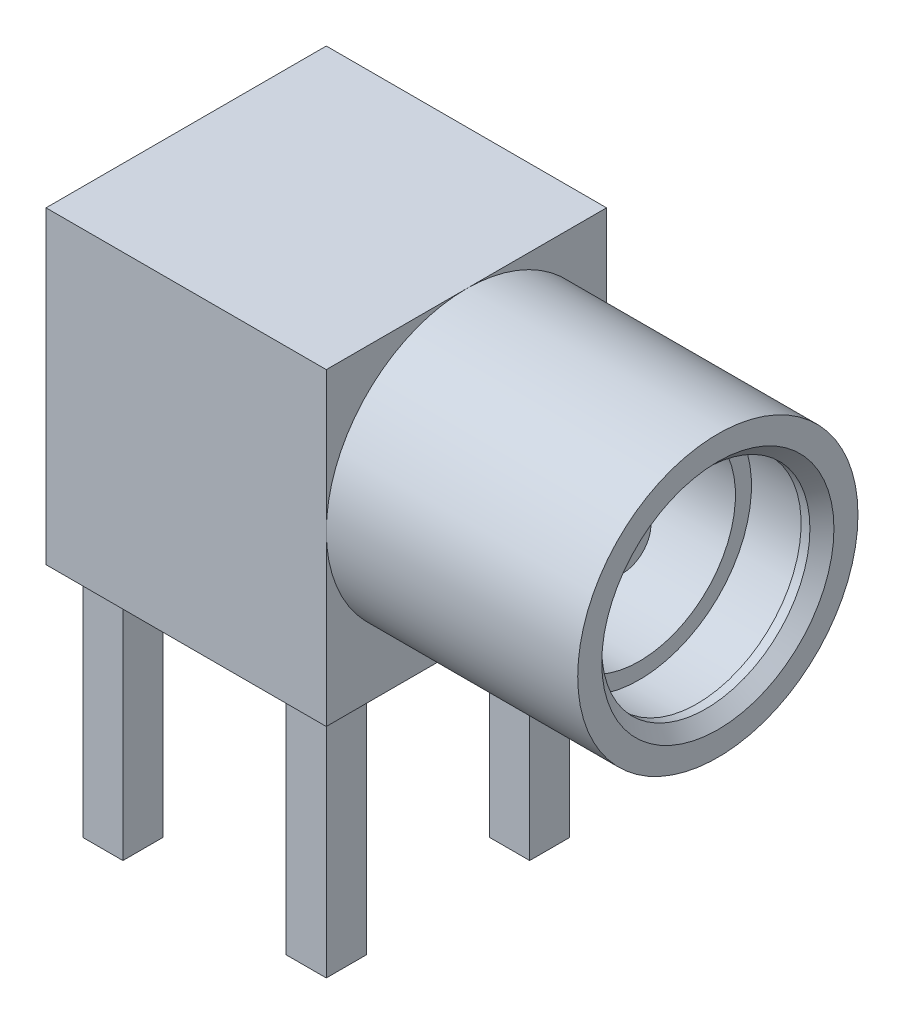
ISO-10303-21;
HEADER;
FILE_DESCRIPTION(('STEP AP214'),'2;1');
FILE_NAME('part.step','',(''),(''),'','','');
FILE_SCHEMA(('AUTOMOTIVE_DESIGN { 1 0 10303 214 1 1 1 1 }'));
ENDSEC;
DATA;
#1=APPLICATION_CONTEXT('core data for automotive mechanical design processes');
#2=APPLICATION_PROTOCOL_DEFINITION('international standard','automotive_design',2000,#1);
#3=PRODUCT_CONTEXT('',#1,'mechanical');
#4=PRODUCT('Part','Part','',(#3));
#5=PRODUCT_RELATED_PRODUCT_CATEGORY('part','',(#4));
#6=PRODUCT_DEFINITION_FORMATION('','',#4);
#7=PRODUCT_DEFINITION_CONTEXT('part definition',#1,'design');
#8=PRODUCT_DEFINITION('design','',#6,#7);
#9=PRODUCT_DEFINITION_SHAPE('','',#8);
#10=(LENGTH_UNIT() NAMED_UNIT(*) SI_UNIT(.MILLI.,.METRE.));
#11=(NAMED_UNIT(*) PLANE_ANGLE_UNIT() SI_UNIT($,.RADIAN.));
#12=(NAMED_UNIT(*) SI_UNIT($,.STERADIAN.) SOLID_ANGLE_UNIT());
#13=UNCERTAINTY_MEASURE_WITH_UNIT(LENGTH_MEASURE(1.E-05),#10,'distance_accuracy_value','');
#14=(GEOMETRIC_REPRESENTATION_CONTEXT(3) GLOBAL_UNCERTAINTY_ASSIGNED_CONTEXT((#13)) GLOBAL_UNIT_ASSIGNED_CONTEXT((#10,
#11,#12)) REPRESENTATION_CONTEXT('',''));
#15=CARTESIAN_POINT('',(0.,0.,0.));
#16=DIRECTION('',(0.,0.,1.));
#17=DIRECTION('',(1.,0.,0.));
#18=AXIS2_PLACEMENT_3D('',#15,#16,#17);
#19=CARTESIAN_POINT('',(41.5125000000001,-45.7600000000006,24.29));
#20=DIRECTION('',(0.,-1.,0.));
#21=DIRECTION('',(0.,0.,-1.));
#22=AXIS2_PLACEMENT_3D('',#19,#20,#21);
#23=PLANE('',#22);
#24=CARTESIAN_POINT('',(39.7625000000001,-45.7600000000006,22.54));
#25=DIRECTION('',(0.,-1.,0.));
#26=DIRECTION('',(0.,0.,-1.));
#27=AXIS2_PLACEMENT_3D('',#24,#25,#26);
#28=CIRCLE('',#27,0.354999999999999);
#29=CARTESIAN_POINT('',(39.7625000000001,-45.7600000000006,22.185));
#30=VERTEX_POINT('',#29);
#31=EDGE_CURVE('E409',#30,#30,#28,.T.);
#32=ORIENTED_EDGE('',*,*,#31,.F.);
#33=EDGE_LOOP('',(#32));
#34=FACE_BOUND('',#33,.T.);
#35=DIRECTION('',(-1.,0.,0.));
#36=VECTOR('',#35,1.);
#37=CARTESIAN_POINT('',(41.5125000000001,-45.7600000000006,20.79));
#38=LINE('',#37,#36);
#39=CARTESIAN_POINT('',(41.5125000000001,-45.7600000000006,20.79));
#40=VERTEX_POINT('',#39);
#41=CARTESIAN_POINT('',(38.0125000000001,-45.7600000000006,20.79));
#42=VERTEX_POINT('',#41);
#43=EDGE_CURVE('E307',#40,#42,#38,.T.);
#44=ORIENTED_EDGE('',*,*,#43,.F.);
#45=DIRECTION('',(0.,0.,-1.));
#46=VECTOR('',#45,1.);
#47=CARTESIAN_POINT('',(41.5125000000001,-45.7600000000006,24.29));
#48=LINE('',#47,#46);
#49=CARTESIAN_POINT('',(41.5125000000001,-45.7600000000006,24.29));
#50=VERTEX_POINT('',#49);
#51=EDGE_CURVE('E330',#50,#40,#48,.T.);
#52=ORIENTED_EDGE('',*,*,#51,.F.);
#53=DIRECTION('',(-1.,0.,0.));
#54=VECTOR('',#53,1.);
#55=CARTESIAN_POINT('',(41.5125000000001,-45.7600000000006,24.29));
#56=LINE('',#55,#54);
#57=CARTESIAN_POINT('',(38.0125000000001,-45.7600000000006,24.29));
#58=VERTEX_POINT('',#57);
#59=EDGE_CURVE('E314',#50,#58,#56,.T.);
#60=ORIENTED_EDGE('',*,*,#59,.T.);
#61=DIRECTION('',(0.,0.,-1.));
#62=VECTOR('',#61,1.);
#63=CARTESIAN_POINT('',(38.0125000000001,-45.7600000000006,24.29));
#64=LINE('',#63,#62);
#65=EDGE_CURVE('E328',#58,#42,#64,.T.);
#66=ORIENTED_EDGE('',*,*,#65,.T.);
#67=EDGE_LOOP('',(#44,#52,#60,#66));
#68=FACE_BOUND('',#67,.T.);
#69=DIRECTION('',(1.,0.,0.));
#70=VECTOR('',#69,1.);
#71=CARTESIAN_POINT('',(38.2425000000001,-45.7600000000006,23.56));
#72=LINE('',#71,#70);
#73=CARTESIAN_POINT('',(38.2425000000001,-45.7600000000006,23.56));
#74=VERTEX_POINT('',#73);
#75=CARTESIAN_POINT('',(38.7425000000001,-45.7600000000006,23.56));
#76=VERTEX_POINT('',#75);
#77=EDGE_CURVE('E279',#74,#76,#72,.T.);
#78=ORIENTED_EDGE('',*,*,#77,.F.);
#79=DIRECTION('',(0.,0.,-1.));
#80=VECTOR('',#79,1.);
#81=CARTESIAN_POINT('',(38.2425000000001,-45.7600000000006,24.06));
#82=LINE('',#81,#80);
#83=CARTESIAN_POINT('',(38.2425000000001,-45.7600000000006,24.06));
#84=VERTEX_POINT('',#83);
#85=EDGE_CURVE('E265',#84,#74,#82,.T.);
#86=ORIENTED_EDGE('',*,*,#85,.F.);
#87=DIRECTION('',(-1.,0.,0.));
#88=VECTOR('',#87,1.);
#89=CARTESIAN_POINT('',(38.2425000000001,-45.7600000000006,24.06));
#90=LINE('',#89,#88);
#91=CARTESIAN_POINT('',(38.7425000000001,-45.7600000000006,24.06));
#92=VERTEX_POINT('',#91);
#93=EDGE_CURVE('E270',#92,#84,#90,.T.);
#94=ORIENTED_EDGE('',*,*,#93,.F.);
#95=DIRECTION('',(0.,0.,1.));
#96=VECTOR('',#95,1.);
#97=CARTESIAN_POINT('',(38.7425000000001,-45.7600000000006,24.06));
#98=LINE('',#97,#96);
#99=EDGE_CURVE('E281',#76,#92,#98,.T.);
#100=ORIENTED_EDGE('',*,*,#99,.F.);
#101=EDGE_LOOP('',(#78,#86,#94,#100));
#102=FACE_BOUND('',#101,.T.);
#103=DIRECTION('',(0.,0.,-1.));
#104=VECTOR('',#103,1.);
#105=CARTESIAN_POINT('',(40.7825000000001,-45.7600000000006,24.06));
#106=LINE('',#105,#104);
#107=CARTESIAN_POINT('',(40.7825000000001,-45.7600000000006,24.06));
#108=VERTEX_POINT('',#107);
#109=CARTESIAN_POINT('',(40.7825000000001,-45.7600000000006,23.56));
#110=VERTEX_POINT('',#109);
#111=EDGE_CURVE('E250',#108,#110,#106,.T.);
#112=ORIENTED_EDGE('',*,*,#111,.F.);
#113=DIRECTION('',(-1.,0.,0.));
#114=VECTOR('',#113,1.);
#115=CARTESIAN_POINT('',(41.2825000000001,-45.7600000000006,24.06));
#116=LINE('',#115,#114);
#117=CARTESIAN_POINT('',(41.2825000000001,-45.7600000000006,24.06));
#118=VERTEX_POINT('',#117);
#119=EDGE_CURVE('E236',#118,#108,#116,.T.);
#120=ORIENTED_EDGE('',*,*,#119,.F.);
#121=DIRECTION('',(0.,0.,1.));
#122=VECTOR('',#121,1.);
#123=CARTESIAN_POINT('',(41.2825000000001,-45.7600000000006,24.06));
#124=LINE('',#123,#122);
#125=CARTESIAN_POINT('',(41.2825000000001,-45.7600000000006,23.56));
#126=VERTEX_POINT('',#125);
#127=EDGE_CURVE('E241',#126,#118,#124,.T.);
#128=ORIENTED_EDGE('',*,*,#127,.F.);
#129=DIRECTION('',(1.,0.,0.));
#130=VECTOR('',#129,1.);
#131=CARTESIAN_POINT('',(41.2825000000001,-45.7600000000006,23.56));
#132=LINE('',#131,#130);
#133=EDGE_CURVE('E252',#110,#126,#132,.T.);
#134=ORIENTED_EDGE('',*,*,#133,.F.);
#135=EDGE_LOOP('',(#112,#120,#128,#134));
#136=FACE_BOUND('',#135,.T.);
#137=DIRECTION('',(-1.,0.,0.));
#138=VECTOR('',#137,1.);
#139=CARTESIAN_POINT('',(41.2825000000001,-45.7600000000006,21.52));
#140=LINE('',#139,#138);
#141=CARTESIAN_POINT('',(41.2825000000001,-45.7600000000006,21.52));
#142=VERTEX_POINT('',#141);
#143=CARTESIAN_POINT('',(40.7825000000001,-45.7600000000006,21.52));
#144=VERTEX_POINT('',#143);
#145=EDGE_CURVE('E208',#142,#144,#140,.T.);
#146=ORIENTED_EDGE('',*,*,#145,.F.);
#147=DIRECTION('',(0.,0.,1.));
#148=VECTOR('',#147,1.);
#149=CARTESIAN_POINT('',(41.2825000000001,-45.7600000000006,21.02));
#150=LINE('',#149,#148);
#151=CARTESIAN_POINT('',(41.2825000000001,-45.7600000000006,21.02));
#152=VERTEX_POINT('',#151);
#153=EDGE_CURVE('E205',#152,#142,#150,.T.);
#154=ORIENTED_EDGE('',*,*,#153,.F.);
#155=DIRECTION('',(1.,0.,0.));
#156=VECTOR('',#155,1.);
#157=CARTESIAN_POINT('',(41.2825000000001,-45.7600000000006,21.02));
#158=LINE('',#157,#156);
#159=CARTESIAN_POINT('',(40.7825000000001,-45.7600000000006,21.02));
#160=VERTEX_POINT('',#159);
#161=EDGE_CURVE('E217',#160,#152,#158,.T.);
#162=ORIENTED_EDGE('',*,*,#161,.F.);
#163=DIRECTION('',(0.,0.,-1.));
#164=VECTOR('',#163,1.);
#165=CARTESIAN_POINT('',(40.7825000000001,-45.7600000000006,21.02));
#166=LINE('',#165,#164);
#167=EDGE_CURVE('E225',#144,#160,#166,.T.);
#168=ORIENTED_EDGE('',*,*,#167,.F.);
#169=EDGE_LOOP('',(#146,#154,#162,#168));
#170=FACE_BOUND('',#169,.T.);
#171=DIRECTION('',(1.,0.,0.));
#172=VECTOR('',#171,1.);
#173=CARTESIAN_POINT('',(38.2425000000001,-45.7600000000006,21.02));
#174=LINE('',#173,#172);
#175=CARTESIAN_POINT('',(38.2425000000001,-45.7600000000006,21.02));
#176=VERTEX_POINT('',#175);
#177=CARTESIAN_POINT('',(38.7425000000001,-45.7600000000006,21.02));
#178=VERTEX_POINT('',#177);
#179=EDGE_CURVE('E412',#176,#178,#174,.T.);
#180=ORIENTED_EDGE('',*,*,#179,.F.);
#181=DIRECTION('',(0.,0.,-1.));
#182=VECTOR('',#181,1.);
#183=CARTESIAN_POINT('',(38.2425000000001,-45.7600000000006,21.02));
#184=LINE('',#183,#182);
#185=CARTESIAN_POINT('',(38.2425000000001,-45.7600000000006,21.52));
#186=VERTEX_POINT('',#185);
#187=EDGE_CURVE('E203',#186,#176,#184,.T.);
#188=ORIENTED_EDGE('',*,*,#187,.F.);
#189=DIRECTION('',(-1.,0.,0.));
#190=VECTOR('',#189,1.);
#191=CARTESIAN_POINT('',(38.2425000000001,-45.7600000000006,21.52));
#192=LINE('',#191,#190);
#193=CARTESIAN_POINT('',(38.7425000000001,-45.7600000000006,21.52));
#194=VERTEX_POINT('',#193);
#195=EDGE_CURVE('E199',#194,#186,#192,.T.);
#196=ORIENTED_EDGE('',*,*,#195,.F.);
#197=DIRECTION('',(0.,0.,1.));
#198=VECTOR('',#197,1.);
#199=CARTESIAN_POINT('',(38.7425000000001,-45.7600000000006,21.02));
#200=LINE('',#199,#198);
#201=EDGE_CURVE('E423',#178,#194,#200,.T.);
#202=ORIENTED_EDGE('',*,*,#201,.F.);
#203=EDGE_LOOP('',(#180,#188,#196,#202));
#204=FACE_BOUND('',#203,.T.);
#205=ADVANCED_FACE('F33',(#34,#68,#102,#136,#170,#204),#23,.T.);
#206=CARTESIAN_POINT('',(41.5125000000001,-41.9000000000005,24.29));
#207=DIRECTION('',(1.,0.,0.));
#208=DIRECTION('',(0.,0.,-1.));
#209=AXIS2_PLACEMENT_3D('',#206,#207,#208);
#210=PLANE('',#209);
#211=CARTESIAN_POINT('',(41.5125000000001,-43.6500000000005,22.54));
#212=DIRECTION('',(1.,0.,0.));
#213=DIRECTION('',(0.,0.,-1.));
#214=AXIS2_PLACEMENT_3D('',#211,#212,#213);
#215=CIRCLE('',#214,1.75);
#216=CARTESIAN_POINT('',(41.5125000000001,-43.6500000000005,20.79));
#217=VERTEX_POINT('',#216);
#218=CARTESIAN_POINT('',(41.5125000000001,-41.9000000000005,22.54));
#219=VERTEX_POINT('',#218);
#220=EDGE_CURVE('E294',#217,#219,#215,.T.);
#221=ORIENTED_EDGE('',*,*,#220,.F.);
#222=DIRECTION('',(0.,-1.,0.));
#223=VECTOR('',#222,1.);
#224=CARTESIAN_POINT('',(41.5125000000001,-41.9000000000005,20.79));
#225=LINE('',#224,#223);
#226=CARTESIAN_POINT('',(41.5125000000001,-41.9000000000005,20.79));
#227=VERTEX_POINT('',#226);
#228=EDGE_CURVE('E324',#227,#217,#225,.T.);
#229=ORIENTED_EDGE('',*,*,#228,.F.);
#230=DIRECTION('',(0.,0.,-1.));
#231=VECTOR('',#230,1.);
#232=CARTESIAN_POINT('',(41.5125000000001,-41.9000000000005,24.29));
#233=LINE('',#232,#231);
#234=EDGE_CURVE('E336',#219,#227,#233,.T.);
#235=ORIENTED_EDGE('',*,*,#234,.F.);
#236=EDGE_LOOP('',(#221,#229,#235));
#237=FACE_BOUND('',#236,.T.);
#238=ADVANCED_FACE('F360',(#237),#210,.T.);
#239=CARTESIAN_POINT('',(41.5125000000001,-43.6500000000005,24.29));
#240=VERTEX_POINT('',#239);
#241=EDGE_CURVE('E301',#219,#240,#215,.T.);
#242=ORIENTED_EDGE('',*,*,#241,.F.);
#243=CARTESIAN_POINT('',(41.5125000000001,-41.9000000000005,24.29));
#244=VERTEX_POINT('',#243);
#245=EDGE_CURVE('E333',#244,#219,#233,.T.);
#246=ORIENTED_EDGE('',*,*,#245,.F.);
#247=DIRECTION('',(0.,-1.,0.));
#248=VECTOR('',#247,1.);
#249=CARTESIAN_POINT('',(41.5125000000001,-41.9000000000005,24.29));
#250=LINE('',#249,#248);
#251=EDGE_CURVE('E311',#244,#240,#250,.T.);
#252=ORIENTED_EDGE('',*,*,#251,.T.);
#253=EDGE_LOOP('',(#242,#246,#252));
#254=FACE_BOUND('',#253,.T.);
#255=ADVANCED_FACE('F366',(#254),#210,.T.);
#256=CARTESIAN_POINT('',(38.0125000000001,-45.7600000000006,24.29));
#257=DIRECTION('',(-1.,0.,0.));
#258=DIRECTION('',(0.,0.,1.));
#259=AXIS2_PLACEMENT_3D('',#256,#257,#258);
#260=PLANE('',#259);
#261=DIRECTION('',(0.,1.,0.));
#262=VECTOR('',#261,1.);
#263=CARTESIAN_POINT('',(38.0125000000001,-45.7600000000006,20.79));
#264=LINE('',#263,#262);
#265=CARTESIAN_POINT('',(38.0125000000001,-41.9000000000005,20.79));
#266=VERTEX_POINT('',#265);
#267=EDGE_CURVE('E298',#42,#266,#264,.T.);
#268=ORIENTED_EDGE('',*,*,#267,.F.);
#269=ORIENTED_EDGE('',*,*,#65,.F.);
#270=DIRECTION('',(0.,1.,0.));
#271=VECTOR('',#270,1.);
#272=CARTESIAN_POINT('',(38.0125000000001,-45.7600000000006,24.29));
#273=LINE('',#272,#271);
#274=CARTESIAN_POINT('',(38.0125000000001,-41.9000000000005,24.29));
#275=VERTEX_POINT('',#274);
#276=EDGE_CURVE('E303',#58,#275,#273,.T.);
#277=ORIENTED_EDGE('',*,*,#276,.T.);
#278=DIRECTION('',(0.,0.,-1.));
#279=VECTOR('',#278,1.);
#280=CARTESIAN_POINT('',(38.0125000000001,-41.9000000000005,24.29));
#281=LINE('',#280,#279);
#282=EDGE_CURVE('E317',#275,#266,#281,.T.);
#283=ORIENTED_EDGE('',*,*,#282,.T.);
#284=EDGE_LOOP('',(#268,#269,#277,#283));
#285=FACE_BOUND('',#284,.T.);
#286=ADVANCED_FACE('F378',(#285),#260,.T.);
#287=EDGE_CURVE('E302',#240,#217,#215,.T.);
#288=ORIENTED_EDGE('',*,*,#287,.F.);
#289=EDGE_CURVE('E310',#240,#50,#250,.T.);
#290=ORIENTED_EDGE('',*,*,#289,.T.);
#291=ORIENTED_EDGE('',*,*,#51,.T.);
#292=EDGE_CURVE('E323',#217,#40,#225,.T.);
#293=ORIENTED_EDGE('',*,*,#292,.F.);
#294=EDGE_LOOP('',(#288,#290,#291,#293));
#295=FACE_BOUND('',#294,.T.);
#296=ADVANCED_FACE('F369',(#295),#210,.T.);
#297=CARTESIAN_POINT('',(38.0125000000001,-41.9000000000005,24.29));
#298=DIRECTION('',(0.,1.,0.));
#299=DIRECTION('',(0.,0.,1.));
#300=AXIS2_PLACEMENT_3D('',#297,#298,#299);
#301=PLANE('',#300);
#302=DIRECTION('',(1.,0.,0.));
#303=VECTOR('',#302,1.);
#304=CARTESIAN_POINT('',(38.0125000000001,-41.9000000000005,20.79));
#305=LINE('',#304,#303);
#306=EDGE_CURVE('E320',#266,#227,#305,.T.);
#307=ORIENTED_EDGE('',*,*,#306,.F.);
#308=ORIENTED_EDGE('',*,*,#282,.F.);
#309=DIRECTION('',(1.,0.,0.));
#310=VECTOR('',#309,1.);
#311=CARTESIAN_POINT('',(38.0125000000001,-41.9000000000005,24.29));
#312=LINE('',#311,#310);
#313=EDGE_CURVE('E306',#275,#244,#312,.T.);
#314=ORIENTED_EDGE('',*,*,#313,.T.);
#315=ORIENTED_EDGE('',*,*,#245,.T.);
#316=ORIENTED_EDGE('',*,*,#234,.T.);
#317=EDGE_LOOP('',(#307,#308,#314,#315,#316));
#318=FACE_BOUND('',#317,.T.);
#319=ADVANCED_FACE('F377',(#318),#301,.T.);
#320=CARTESIAN_POINT('',(0.,0.,24.2900000000001));
#321=DIRECTION('',(0.,0.,-1.));
#322=DIRECTION('',(-1.,0.,0.));
#323=AXIS2_PLACEMENT_3D('',#320,#321,#322);
#324=PLANE('',#323);
#325=ORIENTED_EDGE('',*,*,#276,.F.);
#326=ORIENTED_EDGE('',*,*,#59,.F.);
#327=ORIENTED_EDGE('',*,*,#289,.F.);
#328=ORIENTED_EDGE('',*,*,#251,.F.);
#329=ORIENTED_EDGE('',*,*,#313,.F.);
#330=EDGE_LOOP('',(#325,#326,#327,#328,#329));
#331=FACE_BOUND('',#330,.T.);
#332=ADVANCED_FACE('F382',(#331),#324,.F.);
#333=CARTESIAN_POINT('',(0.,0.,20.7900000000001));
#334=DIRECTION('',(0.,0.,-1.));
#335=DIRECTION('',(-1.,0.,0.));
#336=AXIS2_PLACEMENT_3D('',#333,#334,#335);
#337=PLANE('',#336);
#338=ORIENTED_EDGE('',*,*,#267,.T.);
#339=ORIENTED_EDGE('',*,*,#306,.T.);
#340=ORIENTED_EDGE('',*,*,#228,.T.);
#341=ORIENTED_EDGE('',*,*,#292,.T.);
#342=ORIENTED_EDGE('',*,*,#43,.T.);
#343=EDGE_LOOP('',(#338,#339,#340,#341,#342));
#344=FACE_BOUND('',#343,.T.);
#345=ADVANCED_FACE('F373',(#344),#337,.T.);
#346=CARTESIAN_POINT('',(44.6525000000001,-43.6500000000005,22.54));
#347=DIRECTION('',(-1.,0.,0.));
#348=DIRECTION('',(0.,0.,1.));
#349=AXIS2_PLACEMENT_3D('',#346,#347,#348);
#350=CYLINDRICAL_SURFACE('',#349,1.75);
#351=CARTESIAN_POINT('',(44.6525000000001,-43.6500000000005,22.54));
#352=DIRECTION('',(1.,0.,0.));
#353=DIRECTION('',(0.,0.,-1.));
#354=AXIS2_PLACEMENT_3D('',#351,#352,#353);
#355=CIRCLE('',#354,1.75);
#356=CARTESIAN_POINT('',(44.6525000000001,-43.6500000000005,20.79));
#357=VERTEX_POINT('',#356);
#358=EDGE_CURVE('E295',#357,#357,#355,.T.);
#359=ORIENTED_EDGE('',*,*,#358,.F.);
#360=EDGE_LOOP('',(#359));
#361=FACE_BOUND('',#360,.T.);
#362=ORIENTED_EDGE('',*,*,#220,.T.);
#363=ORIENTED_EDGE('',*,*,#241,.T.);
#364=ORIENTED_EDGE('',*,*,#287,.T.);
#365=EDGE_LOOP('',(#362,#363,#364));
#366=FACE_BOUND('',#365,.T.);
#367=ADVANCED_FACE('F506',(#361,#366),#350,.T.);
#368=CARTESIAN_POINT('',(44.6525000000001,-43.6500000000005,22.54));
#369=DIRECTION('',(1.,0.,0.));
#370=DIRECTION('',(0.,0.,-1.));
#371=AXIS2_PLACEMENT_3D('',#368,#369,#370);
#372=PLANE('',#371);
#373=CARTESIAN_POINT('',(44.6525000000001,-43.6500000000005,22.54));
#374=DIRECTION('',(1.,0.,0.));
#375=DIRECTION('',(0.,0.,-1.));
#376=AXIS2_PLACEMENT_3D('',#373,#374,#375);
#377=CIRCLE('',#376,1.44999999999998);
#378=CARTESIAN_POINT('',(44.6525000000001,-43.6500000000005,21.09));
#379=VERTEX_POINT('',#378);
#380=EDGE_CURVE('E41',#379,#379,#377,.F.);
#381=ORIENTED_EDGE('',*,*,#380,.T.);
#382=EDGE_LOOP('',(#381));
#383=FACE_BOUND('',#382,.T.);
#384=ORIENTED_EDGE('',*,*,#358,.T.);
#385=EDGE_LOOP('',(#384));
#386=FACE_BOUND('',#385,.T.);
#387=ADVANCED_FACE('F346',(#383,#386),#372,.T.);
#388=CARTESIAN_POINT('',(38.2425000000001,-48.7100000000006,24.06));
#389=DIRECTION('',(1.,0.,0.));
#390=DIRECTION('',(0.,0.,-1.));
#391=AXIS2_PLACEMENT_3D('',#388,#389,#390);
#392=PLANE('',#391);
#393=ORIENTED_EDGE('',*,*,#85,.T.);
#394=DIRECTION('',(0.,1.,0.));
#395=VECTOR('',#394,1.);
#396=CARTESIAN_POINT('',(38.2425000000001,-48.7100000000006,23.56));
#397=LINE('',#396,#395);
#398=CARTESIAN_POINT('',(38.2425000000001,-48.7100000000006,23.56));
#399=VERTEX_POINT('',#398);
#400=EDGE_CURVE('E292',#399,#74,#397,.T.);
#401=ORIENTED_EDGE('',*,*,#400,.F.);
#402=DIRECTION('',(0.,0.,-1.));
#403=VECTOR('',#402,1.);
#404=CARTESIAN_POINT('',(38.2425000000001,-48.7100000000006,24.06));
#405=LINE('',#404,#403);
#406=CARTESIAN_POINT('',(38.2425000000001,-48.7100000000006,24.06));
#407=VERTEX_POINT('',#406);
#408=EDGE_CURVE('E266',#407,#399,#405,.T.);
#409=ORIENTED_EDGE('',*,*,#408,.F.);
#410=DIRECTION('',(0.,1.,0.));
#411=VECTOR('',#410,1.);
#412=CARTESIAN_POINT('',(38.2425000000001,-48.7100000000006,24.06));
#413=LINE('',#412,#411);
#414=EDGE_CURVE('E276',#407,#84,#413,.T.);
#415=ORIENTED_EDGE('',*,*,#414,.T.);
#416=EDGE_LOOP('',(#393,#401,#409,#415));
#417=FACE_BOUND('',#416,.T.);
#418=ADVANCED_FACE('F499',(#417),#392,.F.);
#419=CARTESIAN_POINT('',(38.2425000000001,-48.7100000000006,23.56));
#420=DIRECTION('',(0.,0.,1.));
#421=DIRECTION('',(1.,0.,0.));
#422=AXIS2_PLACEMENT_3D('',#419,#420,#421);
#423=PLANE('',#422);
#424=ORIENTED_EDGE('',*,*,#77,.T.);
#425=DIRECTION('',(0.,1.,0.));
#426=VECTOR('',#425,1.);
#427=CARTESIAN_POINT('',(38.7425000000001,-48.7100000000006,23.56));
#428=LINE('',#427,#426);
#429=CARTESIAN_POINT('',(38.7425000000001,-48.7100000000006,23.56));
#430=VERTEX_POINT('',#429);
#431=EDGE_CURVE('E289',#430,#76,#428,.T.);
#432=ORIENTED_EDGE('',*,*,#431,.F.);
#433=DIRECTION('',(1.,0.,0.));
#434=VECTOR('',#433,1.);
#435=CARTESIAN_POINT('',(38.2425000000001,-48.7100000000006,23.56));
#436=LINE('',#435,#434);
#437=EDGE_CURVE('E269',#399,#430,#436,.T.);
#438=ORIENTED_EDGE('',*,*,#437,.F.);
#439=ORIENTED_EDGE('',*,*,#400,.T.);
#440=EDGE_LOOP('',(#424,#432,#438,#439));
#441=FACE_BOUND('',#440,.T.);
#442=ADVANCED_FACE('F495',(#441),#423,.F.);
#443=CARTESIAN_POINT('',(38.7425000000001,-48.7100000000006,24.06));
#444=DIRECTION('',(-1.,0.,0.));
#445=DIRECTION('',(0.,0.,1.));
#446=AXIS2_PLACEMENT_3D('',#443,#444,#445);
#447=PLANE('',#446);
#448=ORIENTED_EDGE('',*,*,#99,.T.);
#449=DIRECTION('',(0.,1.,0.));
#450=VECTOR('',#449,1.);
#451=CARTESIAN_POINT('',(38.7425000000001,-48.7100000000006,24.06));
#452=LINE('',#451,#450);
#453=CARTESIAN_POINT('',(38.7425000000001,-48.7100000000006,24.06));
#454=VERTEX_POINT('',#453);
#455=EDGE_CURVE('E287',#454,#92,#452,.T.);
#456=ORIENTED_EDGE('',*,*,#455,.F.);
#457=DIRECTION('',(0.,0.,1.));
#458=VECTOR('',#457,1.);
#459=CARTESIAN_POINT('',(38.7425000000001,-48.7100000000006,24.06));
#460=LINE('',#459,#458);
#461=EDGE_CURVE('E272',#430,#454,#460,.T.);
#462=ORIENTED_EDGE('',*,*,#461,.F.);
#463=ORIENTED_EDGE('',*,*,#431,.T.);
#464=EDGE_LOOP('',(#448,#456,#462,#463));
#465=FACE_BOUND('',#464,.T.);
#466=ADVANCED_FACE('F491',(#465),#447,.F.);
#467=CARTESIAN_POINT('',(38.2425000000001,-48.7100000000006,24.06));
#468=DIRECTION('',(0.,0.,-1.));
#469=DIRECTION('',(-1.,0.,0.));
#470=AXIS2_PLACEMENT_3D('',#467,#468,#469);
#471=PLANE('',#470);
#472=ORIENTED_EDGE('',*,*,#93,.T.);
#473=ORIENTED_EDGE('',*,*,#414,.F.);
#474=DIRECTION('',(-1.,0.,0.));
#475=VECTOR('',#474,1.);
#476=CARTESIAN_POINT('',(38.2425000000001,-48.7100000000006,24.06));
#477=LINE('',#476,#475);
#478=EDGE_CURVE('E274',#454,#407,#477,.T.);
#479=ORIENTED_EDGE('',*,*,#478,.F.);
#480=ORIENTED_EDGE('',*,*,#455,.T.);
#481=EDGE_LOOP('',(#472,#473,#479,#480));
#482=FACE_BOUND('',#481,.T.);
#483=ADVANCED_FACE('F487',(#482),#471,.F.);
#484=CARTESIAN_POINT('',(0.,-48.7100000000006,0.));
#485=DIRECTION('',(0.,-1.,0.));
#486=DIRECTION('',(0.,0.,-1.));
#487=AXIS2_PLACEMENT_3D('',#484,#485,#486);
#488=PLANE('',#487);
#489=ORIENTED_EDGE('',*,*,#408,.T.);
#490=ORIENTED_EDGE('',*,*,#437,.T.);
#491=ORIENTED_EDGE('',*,*,#461,.T.);
#492=ORIENTED_EDGE('',*,*,#478,.T.);
#493=EDGE_LOOP('',(#489,#490,#491,#492));
#494=FACE_BOUND('',#493,.T.);
#495=ADVANCED_FACE('F483',(#494),#488,.T.);
#496=CARTESIAN_POINT('',(41.2825000000001,-48.7100000000006,24.06));
#497=DIRECTION('',(0.,0.,-1.));
#498=DIRECTION('',(-1.,0.,0.));
#499=AXIS2_PLACEMENT_3D('',#496,#497,#498);
#500=PLANE('',#499);
#501=ORIENTED_EDGE('',*,*,#119,.T.);
#502=DIRECTION('',(0.,1.,0.));
#503=VECTOR('',#502,1.);
#504=CARTESIAN_POINT('',(40.7825000000001,-48.7100000000006,24.06));
#505=LINE('',#504,#503);
#506=CARTESIAN_POINT('',(40.7825000000001,-48.7100000000006,24.06));
#507=VERTEX_POINT('',#506);
#508=EDGE_CURVE('E263',#507,#108,#505,.T.);
#509=ORIENTED_EDGE('',*,*,#508,.F.);
#510=DIRECTION('',(-1.,0.,0.));
#511=VECTOR('',#510,1.);
#512=CARTESIAN_POINT('',(41.2825000000001,-48.7100000000006,24.06));
#513=LINE('',#512,#511);
#514=CARTESIAN_POINT('',(41.2825000000001,-48.7100000000006,24.06));
#515=VERTEX_POINT('',#514);
#516=EDGE_CURVE('E237',#515,#507,#513,.T.);
#517=ORIENTED_EDGE('',*,*,#516,.F.);
#518=DIRECTION('',(0.,1.,0.));
#519=VECTOR('',#518,1.);
#520=CARTESIAN_POINT('',(41.2825000000001,-48.7100000000006,24.06));
#521=LINE('',#520,#519);
#522=EDGE_CURVE('E247',#515,#118,#521,.T.);
#523=ORIENTED_EDGE('',*,*,#522,.T.);
#524=EDGE_LOOP('',(#501,#509,#517,#523));
#525=FACE_BOUND('',#524,.T.);
#526=ADVANCED_FACE('F479',(#525),#500,.F.);
#527=CARTESIAN_POINT('',(40.7825000000001,-48.7100000000006,24.06));
#528=DIRECTION('',(1.,0.,0.));
#529=DIRECTION('',(0.,0.,-1.));
#530=AXIS2_PLACEMENT_3D('',#527,#528,#529);
#531=PLANE('',#530);
#532=ORIENTED_EDGE('',*,*,#111,.T.);
#533=DIRECTION('',(0.,1.,0.));
#534=VECTOR('',#533,1.);
#535=CARTESIAN_POINT('',(40.7825000000001,-48.7100000000006,23.56));
#536=LINE('',#535,#534);
#537=CARTESIAN_POINT('',(40.7825000000001,-48.7100000000006,23.56));
#538=VERTEX_POINT('',#537);
#539=EDGE_CURVE('E260',#538,#110,#536,.T.);
#540=ORIENTED_EDGE('',*,*,#539,.F.);
#541=DIRECTION('',(0.,0.,-1.));
#542=VECTOR('',#541,1.);
#543=CARTESIAN_POINT('',(40.7825000000001,-48.7100000000006,24.06));
#544=LINE('',#543,#542);
#545=EDGE_CURVE('E240',#507,#538,#544,.T.);
#546=ORIENTED_EDGE('',*,*,#545,.F.);
#547=ORIENTED_EDGE('',*,*,#508,.T.);
#548=EDGE_LOOP('',(#532,#540,#546,#547));
#549=FACE_BOUND('',#548,.T.);
#550=ADVANCED_FACE('F475',(#549),#531,.F.);
#551=CARTESIAN_POINT('',(41.2825000000001,-48.7100000000006,23.56));
#552=DIRECTION('',(0.,0.,1.));
#553=DIRECTION('',(1.,0.,0.));
#554=AXIS2_PLACEMENT_3D('',#551,#552,#553);
#555=PLANE('',#554);
#556=ORIENTED_EDGE('',*,*,#133,.T.);
#557=DIRECTION('',(0.,1.,0.));
#558=VECTOR('',#557,1.);
#559=CARTESIAN_POINT('',(41.2825000000001,-48.7100000000006,23.56));
#560=LINE('',#559,#558);
#561=CARTESIAN_POINT('',(41.2825000000001,-48.7100000000006,23.56));
#562=VERTEX_POINT('',#561);
#563=EDGE_CURVE('E258',#562,#126,#560,.T.);
#564=ORIENTED_EDGE('',*,*,#563,.F.);
#565=DIRECTION('',(1.,0.,0.));
#566=VECTOR('',#565,1.);
#567=CARTESIAN_POINT('',(41.2825000000001,-48.7100000000006,23.56));
#568=LINE('',#567,#566);
#569=EDGE_CURVE('E243',#538,#562,#568,.T.);
#570=ORIENTED_EDGE('',*,*,#569,.F.);
#571=ORIENTED_EDGE('',*,*,#539,.T.);
#572=EDGE_LOOP('',(#556,#564,#570,#571));
#573=FACE_BOUND('',#572,.T.);
#574=ADVANCED_FACE('F471',(#573),#555,.F.);
#575=CARTESIAN_POINT('',(41.2825000000001,-48.7100000000006,24.06));
#576=DIRECTION('',(-1.,0.,0.));
#577=DIRECTION('',(0.,0.,1.));
#578=AXIS2_PLACEMENT_3D('',#575,#576,#577);
#579=PLANE('',#578);
#580=ORIENTED_EDGE('',*,*,#127,.T.);
#581=ORIENTED_EDGE('',*,*,#522,.F.);
#582=DIRECTION('',(0.,0.,1.));
#583=VECTOR('',#582,1.);
#584=CARTESIAN_POINT('',(41.2825000000001,-48.7100000000006,24.06));
#585=LINE('',#584,#583);
#586=EDGE_CURVE('E245',#562,#515,#585,.T.);
#587=ORIENTED_EDGE('',*,*,#586,.F.);
#588=ORIENTED_EDGE('',*,*,#563,.T.);
#589=EDGE_LOOP('',(#580,#581,#587,#588));
#590=FACE_BOUND('',#589,.T.);
#591=ADVANCED_FACE('F467',(#590),#579,.F.);
#592=CARTESIAN_POINT('',(0.,-48.7100000000006,0.));
#593=DIRECTION('',(0.,-1.,0.));
#594=DIRECTION('',(0.,0.,-1.));
#595=AXIS2_PLACEMENT_3D('',#592,#593,#594);
#596=PLANE('',#595);
#597=ORIENTED_EDGE('',*,*,#516,.T.);
#598=ORIENTED_EDGE('',*,*,#545,.T.);
#599=ORIENTED_EDGE('',*,*,#569,.T.);
#600=ORIENTED_EDGE('',*,*,#586,.T.);
#601=EDGE_LOOP('',(#597,#598,#599,#600));
#602=FACE_BOUND('',#601,.T.);
#603=ADVANCED_FACE('F463',(#602),#596,.T.);
#604=CARTESIAN_POINT('',(41.2825000000001,-48.7100000000006,21.02));
#605=DIRECTION('',(-1.,0.,0.));
#606=DIRECTION('',(0.,0.,1.));
#607=AXIS2_PLACEMENT_3D('',#604,#605,#606);
#608=PLANE('',#607);
#609=ORIENTED_EDGE('',*,*,#153,.T.);
#610=DIRECTION('',(0.,1.,0.));
#611=VECTOR('',#610,1.);
#612=CARTESIAN_POINT('',(41.2825000000001,-48.7100000000006,21.52));
#613=LINE('',#612,#611);
#614=CARTESIAN_POINT('',(41.2825000000001,-48.7100000000006,21.52));
#615=VERTEX_POINT('',#614);
#616=EDGE_CURVE('E234',#615,#142,#613,.T.);
#617=ORIENTED_EDGE('',*,*,#616,.F.);
#618=DIRECTION('',(0.,0.,1.));
#619=VECTOR('',#618,1.);
#620=CARTESIAN_POINT('',(41.2825000000001,-48.7100000000006,21.02));
#621=LINE('',#620,#619);
#622=CARTESIAN_POINT('',(41.2825000000001,-48.7100000000006,21.02));
#623=VERTEX_POINT('',#622);
#624=EDGE_CURVE('E213',#623,#615,#621,.T.);
#625=ORIENTED_EDGE('',*,*,#624,.F.);
#626=DIRECTION('',(0.,1.,0.));
#627=VECTOR('',#626,1.);
#628=CARTESIAN_POINT('',(41.2825000000001,-48.7100000000006,21.02));
#629=LINE('',#628,#627);
#630=EDGE_CURVE('E222',#623,#152,#629,.T.);
#631=ORIENTED_EDGE('',*,*,#630,.T.);
#632=EDGE_LOOP('',(#609,#617,#625,#631));
#633=FACE_BOUND('',#632,.T.);
#634=ADVANCED_FACE('F459',(#633),#608,.F.);
#635=CARTESIAN_POINT('',(41.2825000000001,-48.7100000000006,21.52));
#636=DIRECTION('',(0.,0.,-1.));
#637=DIRECTION('',(-1.,0.,0.));
#638=AXIS2_PLACEMENT_3D('',#635,#636,#637);
#639=PLANE('',#638);
#640=ORIENTED_EDGE('',*,*,#145,.T.);
#641=DIRECTION('',(0.,1.,0.));
#642=VECTOR('',#641,1.);
#643=CARTESIAN_POINT('',(40.7825000000001,-48.7100000000006,21.52));
#644=LINE('',#643,#642);
#645=CARTESIAN_POINT('',(40.7825000000001,-48.7100000000006,21.52));
#646=VERTEX_POINT('',#645);
#647=EDGE_CURVE('E231',#646,#144,#644,.T.);
#648=ORIENTED_EDGE('',*,*,#647,.F.);
#649=DIRECTION('',(-1.,0.,0.));
#650=VECTOR('',#649,1.);
#651=CARTESIAN_POINT('',(41.2825000000001,-48.7100000000006,21.52));
#652=LINE('',#651,#650);
#653=EDGE_CURVE('E216',#615,#646,#652,.T.);
#654=ORIENTED_EDGE('',*,*,#653,.F.);
#655=ORIENTED_EDGE('',*,*,#616,.T.);
#656=EDGE_LOOP('',(#640,#648,#654,#655));
#657=FACE_BOUND('',#656,.T.);
#658=ADVANCED_FACE('F455',(#657),#639,.F.);
#659=CARTESIAN_POINT('',(40.7825000000001,-48.7100000000006,21.02));
#660=DIRECTION('',(1.,0.,0.));
#661=DIRECTION('',(0.,0.,-1.));
#662=AXIS2_PLACEMENT_3D('',#659,#660,#661);
#663=PLANE('',#662);
#664=ORIENTED_EDGE('',*,*,#167,.T.);
#665=DIRECTION('',(0.,1.,0.));
#666=VECTOR('',#665,1.);
#667=CARTESIAN_POINT('',(40.7825000000001,-48.7100000000006,21.02));
#668=LINE('',#667,#666);
#669=CARTESIAN_POINT('',(40.7825000000001,-48.7100000000006,21.02));
#670=VERTEX_POINT('',#669);
#671=EDGE_CURVE('E56',#670,#160,#668,.T.);
#672=ORIENTED_EDGE('',*,*,#671,.F.);
#673=DIRECTION('',(0.,0.,-1.));
#674=VECTOR('',#673,1.);
#675=CARTESIAN_POINT('',(40.7825000000001,-48.7100000000006,21.02));
#676=LINE('',#675,#674);
#677=EDGE_CURVE('E219',#646,#670,#676,.T.);
#678=ORIENTED_EDGE('',*,*,#677,.F.);
#679=ORIENTED_EDGE('',*,*,#647,.T.);
#680=EDGE_LOOP('',(#664,#672,#678,#679));
#681=FACE_BOUND('',#680,.T.);
#682=ADVANCED_FACE('F452',(#681),#663,.F.);
#683=CARTESIAN_POINT('',(41.2825000000001,-48.7100000000006,21.02));
#684=DIRECTION('',(0.,0.,1.));
#685=DIRECTION('',(1.,0.,0.));
#686=AXIS2_PLACEMENT_3D('',#683,#684,#685);
#687=PLANE('',#686);
#688=ORIENTED_EDGE('',*,*,#161,.T.);
#689=ORIENTED_EDGE('',*,*,#630,.F.);
#690=DIRECTION('',(1.,0.,0.));
#691=VECTOR('',#690,1.);
#692=CARTESIAN_POINT('',(41.2825000000001,-48.7100000000006,21.02));
#693=LINE('',#692,#691);
#694=EDGE_CURVE('E221',#670,#623,#693,.T.);
#695=ORIENTED_EDGE('',*,*,#694,.F.);
#696=ORIENTED_EDGE('',*,*,#671,.T.);
#697=EDGE_LOOP('',(#688,#689,#695,#696));
#698=FACE_BOUND('',#697,.T.);
#699=ADVANCED_FACE('F448',(#698),#687,.F.);
#700=CARTESIAN_POINT('',(0.,-48.7100000000006,0.));
#701=DIRECTION('',(0.,-1.,0.));
#702=DIRECTION('',(0.,0.,-1.));
#703=AXIS2_PLACEMENT_3D('',#700,#701,#702);
#704=PLANE('',#703);
#705=ORIENTED_EDGE('',*,*,#624,.T.);
#706=ORIENTED_EDGE('',*,*,#653,.T.);
#707=ORIENTED_EDGE('',*,*,#677,.T.);
#708=ORIENTED_EDGE('',*,*,#694,.T.);
#709=EDGE_LOOP('',(#705,#706,#707,#708));
#710=FACE_BOUND('',#709,.T.);
#711=ADVANCED_FACE('F445',(#710),#704,.T.);
#712=CARTESIAN_POINT('',(38.2425000000001,-48.7100000000006,21.02));
#713=DIRECTION('',(1.,0.,0.));
#714=DIRECTION('',(0.,0.,-1.));
#715=AXIS2_PLACEMENT_3D('',#712,#713,#714);
#716=PLANE('',#715);
#717=ORIENTED_EDGE('',*,*,#187,.T.);
#718=DIRECTION('',(0.,1.,0.));
#719=VECTOR('',#718,1.);
#720=CARTESIAN_POINT('',(38.2425000000001,-48.7100000000006,21.02));
#721=LINE('',#720,#719);
#722=CARTESIAN_POINT('',(38.2425000000001,-48.7100000000006,21.02));
#723=VERTEX_POINT('',#722);
#724=EDGE_CURVE('E184',#723,#176,#721,.T.);
#725=ORIENTED_EDGE('',*,*,#724,.F.);
#726=DIRECTION('',(0.,0.,-1.));
#727=VECTOR('',#726,1.);
#728=CARTESIAN_POINT('',(38.2425000000001,-48.7100000000006,21.02));
#729=LINE('',#728,#727);
#730=CARTESIAN_POINT('',(38.2425000000001,-48.7100000000006,21.52));
#731=VERTEX_POINT('',#730);
#732=EDGE_CURVE('E191',#731,#723,#729,.T.);
#733=ORIENTED_EDGE('',*,*,#732,.F.);
#734=DIRECTION('',(0.,1.,0.));
#735=VECTOR('',#734,1.);
#736=CARTESIAN_POINT('',(38.2425000000001,-48.7100000000006,21.52));
#737=LINE('',#736,#735);
#738=EDGE_CURVE('E420',#731,#186,#737,.T.);
#739=ORIENTED_EDGE('',*,*,#738,.T.);
#740=EDGE_LOOP('',(#717,#725,#733,#739));
#741=FACE_BOUND('',#740,.T.);
#742=ADVANCED_FACE('F201',(#741),#716,.F.);
#743=CARTESIAN_POINT('',(38.2425000000001,-48.7100000000006,21.02));
#744=DIRECTION('',(0.,0.,1.));
#745=DIRECTION('',(1.,0.,0.));
#746=AXIS2_PLACEMENT_3D('',#743,#744,#745);
#747=PLANE('',#746);
#748=ORIENTED_EDGE('',*,*,#179,.T.);
#749=DIRECTION('',(0.,1.,0.));
#750=VECTOR('',#749,1.);
#751=CARTESIAN_POINT('',(38.7425000000001,-48.7100000000006,21.02));
#752=LINE('',#751,#750);
#753=CARTESIAN_POINT('',(38.7425000000001,-48.7100000000006,21.02));
#754=VERTEX_POINT('',#753);
#755=EDGE_CURVE('E187',#754,#178,#752,.T.);
#756=ORIENTED_EDGE('',*,*,#755,.F.);
#757=DIRECTION('',(1.,0.,0.));
#758=VECTOR('',#757,1.);
#759=CARTESIAN_POINT('',(38.2425000000001,-48.7100000000006,21.02));
#760=LINE('',#759,#758);
#761=EDGE_CURVE('E180',#723,#754,#760,.T.);
#762=ORIENTED_EDGE('',*,*,#761,.F.);
#763=ORIENTED_EDGE('',*,*,#724,.T.);
#764=EDGE_LOOP('',(#748,#756,#762,#763));
#765=FACE_BOUND('',#764,.T.);
#766=ADVANCED_FACE('F182',(#765),#747,.F.);
#767=CARTESIAN_POINT('',(38.7425000000001,-48.7100000000006,21.02));
#768=DIRECTION('',(-1.,0.,0.));
#769=DIRECTION('',(0.,0.,1.));
#770=AXIS2_PLACEMENT_3D('',#767,#768,#769);
#771=PLANE('',#770);
#772=ORIENTED_EDGE('',*,*,#201,.T.);
#773=DIRECTION('',(0.,1.,0.));
#774=VECTOR('',#773,1.);
#775=CARTESIAN_POINT('',(38.7425000000001,-48.7100000000006,21.52));
#776=LINE('',#775,#774);
#777=CARTESIAN_POINT('',(38.7425000000001,-48.7100000000006,21.52));
#778=VERTEX_POINT('',#777);
#779=EDGE_CURVE('E48',#778,#194,#776,.T.);
#780=ORIENTED_EDGE('',*,*,#779,.F.);
#781=DIRECTION('',(0.,0.,1.));
#782=VECTOR('',#781,1.);
#783=CARTESIAN_POINT('',(38.7425000000001,-48.7100000000006,21.02));
#784=LINE('',#783,#782);
#785=EDGE_CURVE('E190',#754,#778,#784,.T.);
#786=ORIENTED_EDGE('',*,*,#785,.F.);
#787=ORIENTED_EDGE('',*,*,#755,.T.);
#788=EDGE_LOOP('',(#772,#780,#786,#787));
#789=FACE_BOUND('',#788,.T.);
#790=ADVANCED_FACE('F430',(#789),#771,.F.);
#791=CARTESIAN_POINT('',(38.2425000000001,-48.7100000000006,21.52));
#792=DIRECTION('',(0.,0.,-1.));
#793=DIRECTION('',(-1.,0.,0.));
#794=AXIS2_PLACEMENT_3D('',#791,#792,#793);
#795=PLANE('',#794);
#796=ORIENTED_EDGE('',*,*,#195,.T.);
#797=ORIENTED_EDGE('',*,*,#738,.F.);
#798=DIRECTION('',(-1.,0.,0.));
#799=VECTOR('',#798,1.);
#800=CARTESIAN_POINT('',(38.2425000000001,-48.7100000000006,21.52));
#801=LINE('',#800,#799);
#802=EDGE_CURVE('E195',#778,#731,#801,.T.);
#803=ORIENTED_EDGE('',*,*,#802,.F.);
#804=ORIENTED_EDGE('',*,*,#779,.T.);
#805=EDGE_LOOP('',(#796,#797,#803,#804));
#806=FACE_BOUND('',#805,.T.);
#807=ADVANCED_FACE('F431',(#806),#795,.F.);
#808=CARTESIAN_POINT('',(0.,-48.7100000000006,0.));
#809=DIRECTION('',(0.,1.,0.));
#810=DIRECTION('',(0.,0.,1.));
#811=AXIS2_PLACEMENT_3D('',#808,#809,#810);
#812=PLANE('',#811);
#813=ORIENTED_EDGE('',*,*,#732,.T.);
#814=ORIENTED_EDGE('',*,*,#761,.T.);
#815=ORIENTED_EDGE('',*,*,#785,.T.);
#816=ORIENTED_EDGE('',*,*,#802,.T.);
#817=EDGE_LOOP('',(#813,#814,#815,#816));
#818=FACE_BOUND('',#817,.T.);
#819=ADVANCED_FACE('F194',(#818),#812,.F.);
#820=CARTESIAN_POINT('',(39.7625000000001,-48.7100000000006,22.54));
#821=DIRECTION('',(0.,1.,0.));
#822=DIRECTION('',(0.,0.,1.));
#823=AXIS2_PLACEMENT_3D('',#820,#821,#822);
#824=CYLINDRICAL_SURFACE('',#823,0.354999999999999);
#825=CARTESIAN_POINT('',(39.7625000000001,-48.5600000000006,22.54));
#826=DIRECTION('',(0.,-1.,0.));
#827=DIRECTION('',(0.,0.,-1.));
#828=AXIS2_PLACEMENT_3D('',#825,#826,#827);
#829=CIRCLE('',#828,0.354999999999999);
#830=CARTESIAN_POINT('',(39.7625000000001,-48.5600000000006,22.185));
#831=VERTEX_POINT('',#830);
#832=EDGE_CURVE('E341',#831,#831,#829,.F.);
#833=ORIENTED_EDGE('',*,*,#832,.T.);
#834=EDGE_LOOP('',(#833));
#835=FACE_BOUND('',#834,.T.);
#836=ORIENTED_EDGE('',*,*,#31,.T.);
#837=EDGE_LOOP('',(#836));
#838=FACE_BOUND('',#837,.T.);
#839=ADVANCED_FACE('F398',(#835,#838),#824,.T.);
#840=CARTESIAN_POINT('',(39.7625000000001,-48.7100000000006,22.54));
#841=DIRECTION('',(0.,-1.,0.));
#842=DIRECTION('',(0.,0.,-1.));
#843=AXIS2_PLACEMENT_3D('',#840,#841,#842);
#844=PLANE('',#843);
#845=CARTESIAN_POINT('',(39.7625000000001,-48.7100000000006,22.54));
#846=DIRECTION('',(0.,-1.,0.));
#847=DIRECTION('',(0.,0.,-1.));
#848=AXIS2_PLACEMENT_3D('',#845,#846,#847);
#849=CIRCLE('',#848,0.205000000000004);
#850=CARTESIAN_POINT('',(39.7625000000001,-48.7100000000006,22.335));
#851=VERTEX_POINT('',#850);
#852=EDGE_CURVE('E338',#851,#851,#849,.T.);
#853=ORIENTED_EDGE('',*,*,#852,.T.);
#854=EDGE_LOOP('',(#853));
#855=FACE_BOUND('',#854,.T.);
#856=ADVANCED_FACE('F389',(#855),#844,.T.);
#857=CARTESIAN_POINT('',(39.7625000000001,-48.7100000000006,22.54));
#858=DIRECTION('',(0.,1.,0.));
#859=DIRECTION('',(0.,0.,1.));
#860=AXIS2_PLACEMENT_3D('',#857,#858,#859);
#861=CONICAL_SURFACE('',#860,0.205000000000004,0.785398163397442);
#862=ORIENTED_EDGE('',*,*,#832,.F.);
#863=EDGE_LOOP('',(#862));
#864=FACE_BOUND('',#863,.T.);
#865=ORIENTED_EDGE('',*,*,#852,.F.);
#866=EDGE_LOOP('',(#865));
#867=FACE_BOUND('',#866,.T.);
#868=ADVANCED_FACE('F386',(#864,#867),#861,.T.);
#869=CARTESIAN_POINT('',(46.3315957379191,-43.6500000000005,22.54));
#870=DIRECTION('',(-1.,0.,0.));
#871=DIRECTION('',(0.,0.,1.));
#872=AXIS2_PLACEMENT_3D('',#869,#870,#871);
#873=CYLINDRICAL_SURFACE('',#872,1.3);
#874=CARTESIAN_POINT('',(44.5025000000001,-43.6500000000005,22.54));
#875=DIRECTION('',(1.,0.,0.));
#876=DIRECTION('',(0.,0.,-1.));
#877=AXIS2_PLACEMENT_3D('',#874,#875,#876);
#878=CIRCLE('',#877,1.3);
#879=CARTESIAN_POINT('',(44.5025000000001,-43.6500000000005,21.24));
#880=VERTEX_POINT('',#879);
#881=EDGE_CURVE('E11',#880,#880,#878,.T.);
#882=ORIENTED_EDGE('',*,*,#881,.T.);
#883=EDGE_LOOP('',(#882));
#884=FACE_BOUND('',#883,.T.);
#885=CARTESIAN_POINT('',(44.3925000000001,-43.6500000000005,22.54));
#886=DIRECTION('',(-1.,0.,0.));
#887=DIRECTION('',(0.,0.,1.));
#888=AXIS2_PLACEMENT_3D('',#885,#886,#887);
#889=CIRCLE('',#888,1.3);
#890=CARTESIAN_POINT('',(44.3925000000001,-43.6500000000005,23.84));
#891=VERTEX_POINT('',#890);
#892=EDGE_CURVE('E410',#891,#891,#889,.T.);
#893=ORIENTED_EDGE('',*,*,#892,.T.);
#894=EDGE_LOOP('',(#893));
#895=FACE_BOUND('',#894,.T.);
#896=ADVANCED_FACE('F388',(#884,#895),#873,.F.);
#897=CARTESIAN_POINT('',(44.3925000000001,-42.3500000000005,22.54));
#898=DIRECTION('',(1.,0.,0.));
#899=DIRECTION('',(0.,0.,-1.));
#900=AXIS2_PLACEMENT_3D('',#897,#898,#899);
#901=PLANE('',#900);
#902=ORIENTED_EDGE('',*,*,#892,.F.);
#903=EDGE_LOOP('',(#902));
#904=FACE_BOUND('',#903,.T.);
#905=CARTESIAN_POINT('',(44.3925000000001,-43.6500000000005,22.54));
#906=DIRECTION('',(-1.,0.,0.));
#907=DIRECTION('',(0.,0.,1.));
#908=AXIS2_PLACEMENT_3D('',#905,#906,#907);
#909=CIRCLE('',#908,1.4);
#910=CARTESIAN_POINT('',(44.3925000000001,-43.6500000000005,23.94));
#911=VERTEX_POINT('',#910);
#912=EDGE_CURVE('E415',#911,#911,#909,.T.);
#913=ORIENTED_EDGE('',*,*,#912,.T.);
#914=EDGE_LOOP('',(#913));
#915=FACE_BOUND('',#914,.T.);
#916=ADVANCED_FACE('F395',(#904,#915),#901,.F.);
#917=CARTESIAN_POINT('',(46.3315957379191,-43.6500000000005,22.54));
#918=DIRECTION('',(-1.,0.,0.));
#919=DIRECTION('',(0.,0.,1.));
#920=AXIS2_PLACEMENT_3D('',#917,#918,#919);
#921=CYLINDRICAL_SURFACE('',#920,1.4);
#922=ORIENTED_EDGE('',*,*,#912,.F.);
#923=EDGE_LOOP('',(#922));
#924=FACE_BOUND('',#923,.T.);
#925=CARTESIAN_POINT('',(43.6725000000001,-43.6500000000005,22.54));
#926=DIRECTION('',(-1.,0.,0.));
#927=DIRECTION('',(0.,0.,1.));
#928=AXIS2_PLACEMENT_3D('',#925,#926,#927);
#929=CIRCLE('',#928,1.4);
#930=CARTESIAN_POINT('',(43.6725000000001,-43.6500000000005,23.94));
#931=VERTEX_POINT('',#930);
#932=EDGE_CURVE('E805',#931,#931,#929,.T.);
#933=ORIENTED_EDGE('',*,*,#932,.T.);
#934=EDGE_LOOP('',(#933));
#935=FACE_BOUND('',#934,.T.);
#936=ADVANCED_FACE('F716',(#924,#935),#921,.F.);
#937=CARTESIAN_POINT('',(43.6725000000001,-42.2500000000005,22.54));
#938=DIRECTION('',(-1.,0.,0.));
#939=DIRECTION('',(0.,0.,1.));
#940=AXIS2_PLACEMENT_3D('',#937,#938,#939);
#941=PLANE('',#940);
#942=ORIENTED_EDGE('',*,*,#932,.F.);
#943=EDGE_LOOP('',(#942));
#944=FACE_BOUND('',#943,.T.);
#945=CARTESIAN_POINT('',(43.6725000000001,-43.6500000000005,22.54));
#946=DIRECTION('',(-1.,0.,0.));
#947=DIRECTION('',(0.,0.,1.));
#948=AXIS2_PLACEMENT_3D('',#945,#946,#947);
#949=CIRCLE('',#948,1.2);
#950=CARTESIAN_POINT('',(43.6725000000001,-43.6500000000005,23.74));
#951=VERTEX_POINT('',#950);
#952=EDGE_CURVE('E802',#951,#951,#949,.T.);
#953=ORIENTED_EDGE('',*,*,#952,.T.);
#954=EDGE_LOOP('',(#953));
#955=FACE_BOUND('',#954,.T.);
#956=ADVANCED_FACE('F726',(#944,#955),#941,.F.);
#957=CARTESIAN_POINT('',(46.3315957379191,-43.6500000000005,22.54));
#958=DIRECTION('',(-1.,0.,0.));
#959=DIRECTION('',(0.,0.,1.));
#960=AXIS2_PLACEMENT_3D('',#957,#958,#959);
#961=CYLINDRICAL_SURFACE('',#960,1.2);
#962=ORIENTED_EDGE('',*,*,#952,.F.);
#963=EDGE_LOOP('',(#962));
#964=FACE_BOUND('',#963,.T.);
#965=CARTESIAN_POINT('',(42.0625000000001,-43.6500000000005,22.54));
#966=DIRECTION('',(-1.,0.,0.));
#967=DIRECTION('',(0.,0.,1.));
#968=AXIS2_PLACEMENT_3D('',#965,#966,#967);
#969=CIRCLE('',#968,1.2);
#970=CARTESIAN_POINT('',(42.0625000000001,-43.6500000000005,23.74));
#971=VERTEX_POINT('',#970);
#972=EDGE_CURVE('E797',#971,#971,#969,.T.);
#973=ORIENTED_EDGE('',*,*,#972,.T.);
#974=EDGE_LOOP('',(#973));
#975=FACE_BOUND('',#974,.T.);
#976=ADVANCED_FACE('F736',(#964,#975),#961,.F.);
#977=CARTESIAN_POINT('',(42.0625000000001,-42.4500000000005,22.54));
#978=DIRECTION('',(-1.,0.,0.));
#979=DIRECTION('',(0.,0.,1.));
#980=AXIS2_PLACEMENT_3D('',#977,#978,#979);
#981=PLANE('',#980);
#982=ORIENTED_EDGE('',*,*,#972,.F.);
#983=EDGE_LOOP('',(#982));
#984=FACE_BOUND('',#983,.T.);
#985=CARTESIAN_POINT('',(42.0625000000001,-43.6500000000005,22.54));
#986=DIRECTION('',(-1.,0.,0.));
#987=DIRECTION('',(0.,0.,1.));
#988=AXIS2_PLACEMENT_3D('',#985,#986,#987);
#989=CIRCLE('',#988,0.355000000000001);
#990=CARTESIAN_POINT('',(42.0625000000001,-43.6500000000005,22.895));
#991=VERTEX_POINT('',#990);
#992=EDGE_CURVE('E792',#991,#991,#989,.T.);
#993=ORIENTED_EDGE('',*,*,#992,.T.);
#994=EDGE_LOOP('',(#993));
#995=FACE_BOUND('',#994,.T.);
#996=ADVANCED_FACE('F746',(#984,#995),#981,.F.);
#997=CARTESIAN_POINT('',(46.3315957379191,-43.6500000000005,22.54));
#998=DIRECTION('',(-1.,0.,0.));
#999=DIRECTION('',(0.,0.,1.));
#1000=AXIS2_PLACEMENT_3D('',#997,#998,#999);
#1001=CYLINDRICAL_SURFACE('',#1000,0.355000000000001);
#1002=ORIENTED_EDGE('',*,*,#992,.F.);
#1003=EDGE_LOOP('',(#1002));
#1004=FACE_BOUND('',#1003,.T.);
#1005=CARTESIAN_POINT('',(43.4625000000001,-43.6500000000005,22.54));
#1006=DIRECTION('',(-1.,0.,0.));
#1007=DIRECTION('',(0.,0.,1.));
#1008=AXIS2_PLACEMENT_3D('',#1005,#1006,#1007);
#1009=CIRCLE('',#1008,0.355000000000001);
#1010=CARTESIAN_POINT('',(43.4625000000001,-43.6500000000005,22.895));
#1011=VERTEX_POINT('',#1010);
#1012=EDGE_CURVE('E795',#1011,#1011,#1009,.T.);
#1013=ORIENTED_EDGE('',*,*,#1012,.T.);
#1014=EDGE_LOOP('',(#1013));
#1015=FACE_BOUND('',#1014,.T.);
#1016=ADVANCED_FACE('F355',(#1004,#1015),#1001,.T.);
#1017=CARTESIAN_POINT('',(43.4625000000001,-43.2950000000005,22.54));
#1018=DIRECTION('',(-1.,0.,0.));
#1019=DIRECTION('',(0.,0.,1.));
#1020=AXIS2_PLACEMENT_3D('',#1017,#1018,#1019);
#1021=PLANE('',#1020);
#1022=ORIENTED_EDGE('',*,*,#1012,.F.);
#1023=EDGE_LOOP('',(#1022));
#1024=FACE_BOUND('',#1023,.T.);
#1025=ADVANCED_FACE('F350',(#1024),#1021,.F.);
#1026=CARTESIAN_POINT('',(44.6525000000001,-43.6500000000005,22.54));
#1027=DIRECTION('',(1.,0.,0.));
#1028=DIRECTION('',(0.,0.,-1.));
#1029=AXIS2_PLACEMENT_3D('',#1026,#1027,#1028);
#1030=CONICAL_SURFACE('',#1029,1.45000000000001,0.785398163397476);
#1031=ORIENTED_EDGE('',*,*,#881,.F.);
#1032=EDGE_LOOP('',(#1031));
#1033=FACE_BOUND('',#1032,.T.);
#1034=ORIENTED_EDGE('',*,*,#380,.F.);
#1035=EDGE_LOOP('',(#1034));
#1036=FACE_BOUND('',#1035,.T.);
#1037=ADVANCED_FACE('F35',(#1033,#1036),#1030,.F.);
#1038=CLOSED_SHELL('',(#205,#238,#255,#286,#296,#319,#332,#345,#367,#387,#418,#442,#466,#483,
#495,#526,#550,#574,#591,#603,#634,#658,#682,#699,#711,#742,#766,#790,#807,#819,#839,#856,#868,
#896,#916,#936,#956,#976,#996,#1016,#1025,#1037));
#1039=MANIFOLD_SOLID_BREP('B2',#1038);
#1040=ADVANCED_BREP_SHAPE_REPRESENTATION('',(#18,#1039),#14);
#1041=SHAPE_DEFINITION_REPRESENTATION(#9,#1040);
ENDSEC;
END-ISO-10303-21;
